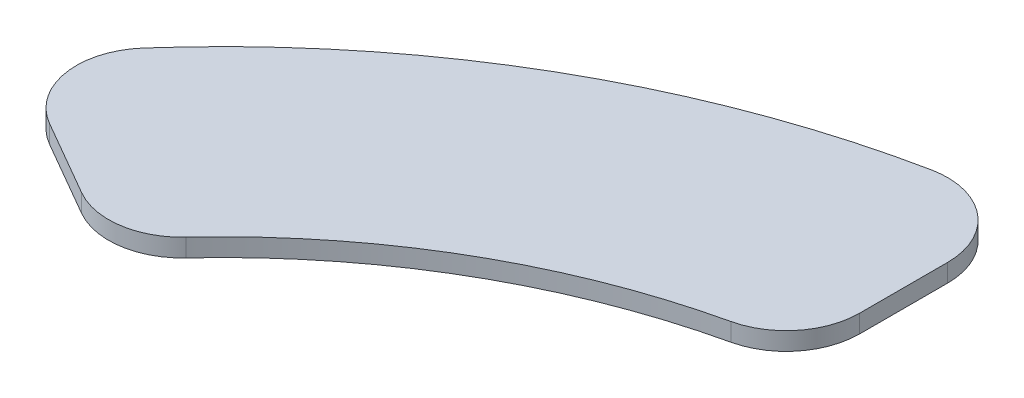
ISO-10303-21;
HEADER;
FILE_DESCRIPTION(('STEP AP214'),'2;1');
FILE_NAME('part.step','',(''),(''),'','','');
FILE_SCHEMA(('AUTOMOTIVE_DESIGN { 1 0 10303 214 1 1 1 1 }'));
ENDSEC;
DATA;
#1=APPLICATION_CONTEXT('core data for automotive mechanical design processes');
#2=APPLICATION_PROTOCOL_DEFINITION('international standard','automotive_design',2000,#1);
#3=PRODUCT_CONTEXT('',#1,'mechanical');
#4=PRODUCT('Part','Part','',(#3));
#5=PRODUCT_RELATED_PRODUCT_CATEGORY('part','',(#4));
#6=PRODUCT_DEFINITION_FORMATION('','',#4);
#7=PRODUCT_DEFINITION_CONTEXT('part definition',#1,'design');
#8=PRODUCT_DEFINITION('design','',#6,#7);
#9=PRODUCT_DEFINITION_SHAPE('','',#8);
#10=(LENGTH_UNIT() NAMED_UNIT(*) SI_UNIT(.MILLI.,.METRE.));
#11=(NAMED_UNIT(*) PLANE_ANGLE_UNIT() SI_UNIT($,.RADIAN.));
#12=(NAMED_UNIT(*) SI_UNIT($,.STERADIAN.) SOLID_ANGLE_UNIT());
#13=UNCERTAINTY_MEASURE_WITH_UNIT(LENGTH_MEASURE(1.E-05),#10,'distance_accuracy_value','');
#14=(GEOMETRIC_REPRESENTATION_CONTEXT(3) GLOBAL_UNCERTAINTY_ASSIGNED_CONTEXT((#13)) GLOBAL_UNIT_ASSIGNED_CONTEXT((#10,
#11,#12)) REPRESENTATION_CONTEXT('',''));
#15=CARTESIAN_POINT('',(0.,0.,0.));
#16=DIRECTION('',(0.,0.,1.));
#17=DIRECTION('',(1.,0.,0.));
#18=AXIS2_PLACEMENT_3D('',#15,#16,#17);
#19=CARTESIAN_POINT('',(62.5,124.639714135106,13.2525304162195));
#20=DIRECTION('',(0.,1.,0.));
#21=DIRECTION('',(0.,0.,1.));
#22=AXIS2_PLACEMENT_3D('',#19,#20,#21);
#23=CYLINDRICAL_SURFACE('',#22,5.55803388853137);
#24=CARTESIAN_POINT('',(62.5,125.999,13.2525304162195));
#25=DIRECTION('',(0.,1.,0.));
#26=DIRECTION('',(1.,0.,0.));
#27=AXIS2_PLACEMENT_3D('',#24,#25,#26);
#28=CIRCLE('',#27,5.55803388853137);
#29=CARTESIAN_POINT('',(68.0580338885314,125.999,13.2525304162195));
#30=VERTEX_POINT('',#29);
#31=CARTESIAN_POINT('',(61.3972154983073,125.999,7.80499821816059));
#32=VERTEX_POINT('',#31);
#33=EDGE_CURVE('E112',#30,#32,#28,.T.);
#34=ORIENTED_EDGE('',*,*,#33,.F.);
#35=DIRECTION('',(0.,1.,0.));
#36=VECTOR('',#35,1.);
#37=CARTESIAN_POINT('',(68.0580338885314,124.639714135106,13.2525304162195));
#38=LINE('',#37,#36);
#39=CARTESIAN_POINT('',(68.0580338885314,124.639714135106,13.2525304162195));
#40=VERTEX_POINT('',#39);
#41=EDGE_CURVE('E32',#40,#30,#38,.T.);
#42=ORIENTED_EDGE('',*,*,#41,.F.);
#43=CARTESIAN_POINT('',(62.5,124.639714135106,13.2525304162195));
#44=DIRECTION('',(0.,1.,0.));
#45=DIRECTION('',(1.,0.,0.));
#46=AXIS2_PLACEMENT_3D('',#43,#44,#45);
#47=CIRCLE('',#46,5.55803388853137);
#48=CARTESIAN_POINT('',(61.3972154983073,124.639714135106,7.80499821816059));
#49=VERTEX_POINT('',#48);
#50=EDGE_CURVE('E132',#40,#49,#47,.T.);
#51=ORIENTED_EDGE('',*,*,#50,.T.);
#52=DIRECTION('',(0.,1.,0.));
#53=VECTOR('',#52,1.);
#54=CARTESIAN_POINT('',(61.3972154983073,124.639714135106,7.80499821816059));
#55=LINE('',#54,#53);
#56=EDGE_CURVE('E10',#49,#32,#55,.T.);
#57=ORIENTED_EDGE('',*,*,#56,.T.);
#58=EDGE_LOOP('',(#34,#42,#51,#57));
#59=FACE_BOUND('',#58,.T.);
#60=ADVANCED_FACE('F16',(#59),#23,.T.);
#61=CARTESIAN_POINT('',(75.,124.639714135106,75.0000000000009));
#62=DIRECTION('',(0.,1.,0.));
#63=DIRECTION('',(0.,0.,1.));
#64=AXIS2_PLACEMENT_3D('',#61,#62,#63);
#65=CYLINDRICAL_SURFACE('',#64,68.5580338885313);
#66=CARTESIAN_POINT('',(75.,125.998999999999,75.0000000000009));
#67=DIRECTION('',(0.,1.,0.));
#68=DIRECTION('',(-0.198412698412699,0.,-0.980118564821926));
#69=AXIS2_PLACEMENT_3D('',#66,#67,#68);
#70=CIRCLE('',#69,68.5580338885313);
#71=CARTESIAN_POINT('',(23.6088137004321,125.999,29.6221421684095));
#72=VERTEX_POINT('',#71);
#73=EDGE_CURVE('E115',#32,#72,#70,.T.);
#74=ORIENTED_EDGE('',*,*,#73,.F.);
#75=ORIENTED_EDGE('',*,*,#56,.F.);
#76=CARTESIAN_POINT('',(75.,124.639714135106,75.0000000000009));
#77=DIRECTION('',(0.,1.,0.));
#78=DIRECTION('',(-0.198412698412699,0.,-0.980118564821926));
#79=AXIS2_PLACEMENT_3D('',#76,#77,#78);
#80=CIRCLE('',#79,68.5580338885313);
#81=CARTESIAN_POINT('',(23.6088137004321,124.639714135106,29.6221421684095));
#82=VERTEX_POINT('',#81);
#83=EDGE_CURVE('E141',#49,#82,#80,.T.);
#84=ORIENTED_EDGE('',*,*,#83,.T.);
#85=DIRECTION('',(0.,1.,0.));
#86=VECTOR('',#85,1.);
#87=CARTESIAN_POINT('',(23.6088137004321,124.639714135106,29.6221421684095));
#88=LINE('',#87,#86);
#89=EDGE_CURVE('E24',#82,#72,#88,.T.);
#90=ORIENTED_EDGE('',*,*,#89,.T.);
#91=EDGE_LOOP('',(#74,#75,#84,#90));
#92=FACE_BOUND('',#91,.T.);
#93=ADVANCED_FACE('F140',(#92),#65,.T.);
#94=CARTESIAN_POINT('',(27.7751227210385,124.639714135106,33.3009476608047));
#95=DIRECTION('',(0.,1.,0.));
#96=DIRECTION('',(0.,0.,1.));
#97=AXIS2_PLACEMENT_3D('',#94,#95,#96);
#98=CYLINDRICAL_SURFACE('',#97,5.55803388853136);
#99=CARTESIAN_POINT('',(27.7751227210385,125.999,33.3009476608047));
#100=DIRECTION('',(0.,1.,0.));
#101=DIRECTION('',(-0.749601226650182,0.,-0.661889719669782));
#102=AXIS2_PLACEMENT_3D('',#99,#100,#101);
#103=CIRCLE('',#102,5.55803388853136);
#104=CARTESIAN_POINT('',(24.9961057767728,125.999,38.1143462033677));
#105=VERTEX_POINT('',#104);
#106=EDGE_CURVE('E118',#72,#105,#103,.T.);
#107=ORIENTED_EDGE('',*,*,#106,.F.);
#108=ORIENTED_EDGE('',*,*,#89,.F.);
#109=CARTESIAN_POINT('',(27.7751227210385,124.639714135106,33.3009476608047));
#110=DIRECTION('',(0.,1.,0.));
#111=DIRECTION('',(-0.749601226650182,0.,-0.661889719669782));
#112=AXIS2_PLACEMENT_3D('',#109,#110,#111);
#113=CIRCLE('',#112,5.55803388853136);
#114=CARTESIAN_POINT('',(24.9961057767728,124.639714135106,38.1143462033677));
#115=VERTEX_POINT('',#114);
#116=EDGE_CURVE('E150',#82,#115,#113,.T.);
#117=ORIENTED_EDGE('',*,*,#116,.T.);
#118=DIRECTION('',(0.,1.,0.));
#119=VECTOR('',#118,1.);
#120=CARTESIAN_POINT('',(24.9961057767728,124.639714135106,38.1143462033677));
#121=LINE('',#120,#119);
#122=EDGE_CURVE('E138',#115,#105,#121,.T.);
#123=ORIENTED_EDGE('',*,*,#122,.T.);
#124=EDGE_LOOP('',(#107,#108,#117,#123));
#125=FACE_BOUND('',#124,.T.);
#126=ADVANCED_FACE('F145',(#125),#98,.T.);
#127=CARTESIAN_POINT('',(24.9961057767728,124.639714135106,38.1143462033677));
#128=DIRECTION('',(-0.5,0.,0.866025403784439));
#129=DIRECTION('',(0.866025403784439,0.,0.5));
#130=AXIS2_PLACEMENT_3D('',#127,#128,#129);
#131=PLANE('',#130);
#132=DIRECTION('',(0.866025403784439,0.,0.5));
#133=VECTOR('',#132,1.);
#134=CARTESIAN_POINT('',(24.9961057767728,125.999,38.1143462033677));
#135=LINE('',#134,#133);
#136=CARTESIAN_POINT('',(30.7530618939737,125.999,41.4381263673465));
#137=VERTEX_POINT('',#136);
#138=EDGE_CURVE('E121',#105,#137,#135,.T.);
#139=ORIENTED_EDGE('',*,*,#138,.F.);
#140=ORIENTED_EDGE('',*,*,#122,.F.);
#141=DIRECTION('',(0.866025403784439,0.,0.5));
#142=VECTOR('',#141,1.);
#143=CARTESIAN_POINT('',(24.9961057767728,124.639714135106,38.1143462033677));
#144=LINE('',#143,#142);
#145=CARTESIAN_POINT('',(30.7530618939737,124.639714135106,41.4381263673465));
#146=VERTEX_POINT('',#145);
#147=EDGE_CURVE('E154',#115,#146,#144,.T.);
#148=ORIENTED_EDGE('',*,*,#147,.T.);
#149=DIRECTION('',(0.,1.,0.));
#150=VECTOR('',#149,1.);
#151=CARTESIAN_POINT('',(30.7530618939737,124.639714135106,41.4381263673465));
#152=LINE('',#151,#150);
#153=EDGE_CURVE('E136',#146,#137,#152,.T.);
#154=ORIENTED_EDGE('',*,*,#153,.T.);
#155=EDGE_LOOP('',(#139,#140,#148,#154));
#156=FACE_BOUND('',#155,.T.);
#157=ADVANCED_FACE('F161',(#156),#131,.T.);
#158=CARTESIAN_POINT('',(33.5320788382394,124.639714135106,36.6247278247835));
#159=DIRECTION('',(0.,1.,0.));
#160=DIRECTION('',(0.,0.,1.));
#161=AXIS2_PLACEMENT_3D('',#158,#159,#160);
#162=CYLINDRICAL_SURFACE('',#161,5.55803388853137);
#163=CARTESIAN_POINT('',(33.5320788382394,125.999,36.6247278247835));
#164=DIRECTION('',(0.,1.,0.));
#165=DIRECTION('',(-0.5,0.,0.866025403784439));
#166=AXIS2_PLACEMENT_3D('',#163,#164,#165);
#167=CIRCLE('',#166,5.55803388853137);
#168=CARTESIAN_POINT('',(37.6113728400804,125.999,40.3997908908273));
#169=VERTEX_POINT('',#168);
#170=EDGE_CURVE('E124',#137,#169,#167,.T.);
#171=ORIENTED_EDGE('',*,*,#170,.F.);
#172=ORIENTED_EDGE('',*,*,#153,.F.);
#173=CARTESIAN_POINT('',(33.5320788382394,124.639714135106,36.6247278247835));
#174=DIRECTION('',(0.,1.,0.));
#175=DIRECTION('',(-0.5,0.,0.866025403784439));
#176=AXIS2_PLACEMENT_3D('',#173,#174,#175);
#177=CIRCLE('',#176,5.55803388853137);
#178=CARTESIAN_POINT('',(37.6113728400804,124.639714135106,40.3997908908273));
#179=VERTEX_POINT('',#178);
#180=EDGE_CURVE('E103',#146,#179,#177,.T.);
#181=ORIENTED_EDGE('',*,*,#180,.T.);
#182=DIRECTION('',(0.,1.,0.));
#183=VECTOR('',#182,1.);
#184=CARTESIAN_POINT('',(37.6113728400804,124.639714135106,40.3997908908273));
#185=LINE('',#184,#183);
#186=EDGE_CURVE('E95',#179,#169,#185,.T.);
#187=ORIENTED_EDGE('',*,*,#186,.T.);
#188=EDGE_LOOP('',(#171,#172,#181,#187));
#189=FACE_BOUND('',#188,.T.);
#190=ADVANCED_FACE('F158',(#189),#162,.T.);
#191=CARTESIAN_POINT('',(75.,124.639714135106,75.0000000000009));
#192=DIRECTION('',(0.,1.,0.));
#193=DIRECTION('',(0.,0.,1.));
#194=AXIS2_PLACEMENT_3D('',#191,#192,#193);
#195=CYLINDRICAL_SURFACE('',#194,50.9419661114686);
#196=CARTESIAN_POINT('',(75.,125.998999999999,75.0000000000009));
#197=DIRECTION('',(0.,-1.,0.));
#198=DIRECTION('',(-0.733945507287798,0.,-0.679208357083493));
#199=AXIS2_PLACEMENT_3D('',#196,#197,#198);
#200=CIRCLE('',#199,50.9419661114686);
#201=CARTESIAN_POINT('',(63.7296535151618,125.999,25.3203945122988));
#202=VERTEX_POINT('',#201);
#203=EDGE_CURVE('E127',#169,#202,#200,.T.);
#204=ORIENTED_EDGE('',*,*,#203,.F.);
#205=ORIENTED_EDGE('',*,*,#186,.F.);
#206=CARTESIAN_POINT('',(75.,124.639714135106,75.0000000000009));
#207=DIRECTION('',(0.,-1.,0.));
#208=DIRECTION('',(-0.733945507287798,0.,-0.679208357083493));
#209=AXIS2_PLACEMENT_3D('',#206,#207,#208);
#210=CIRCLE('',#209,50.9419661114686);
#211=CARTESIAN_POINT('',(63.7296535151618,124.639714135106,25.3203945122988));
#212=VERTEX_POINT('',#211);
#213=EDGE_CURVE('E98',#179,#212,#210,.T.);
#214=ORIENTED_EDGE('',*,*,#213,.T.);
#215=DIRECTION('',(0.,1.,0.));
#216=VECTOR('',#215,1.);
#217=CARTESIAN_POINT('',(63.7296535151618,124.639714135106,25.3203945122988));
#218=LINE('',#217,#216);
#219=EDGE_CURVE('E84',#212,#202,#218,.T.);
#220=ORIENTED_EDGE('',*,*,#219,.T.);
#221=EDGE_LOOP('',(#204,#205,#214,#220));
#222=FACE_BOUND('',#221,.T.);
#223=ADVANCED_FACE('F99',(#222),#195,.F.);
#224=CARTESIAN_POINT('',(62.5,124.639714135106,19.9000907441772));
#225=DIRECTION('',(0.,1.,0.));
#226=DIRECTION('',(0.,0.,1.));
#227=AXIS2_PLACEMENT_3D('',#224,#225,#226);
#228=CYLINDRICAL_SURFACE('',#227,5.55803388853137);
#229=CARTESIAN_POINT('',(62.5,125.999,19.9000907441772));
#230=DIRECTION('',(0.,1.,0.));
#231=DIRECTION('',(0.221238938053101,0.,0.975219632846435));
#232=AXIS2_PLACEMENT_3D('',#229,#230,#231);
#233=CIRCLE('',#232,5.55803388853137);
#234=CARTESIAN_POINT('',(68.0580338885314,125.999,19.9000907441772));
#235=VERTEX_POINT('',#234);
#236=EDGE_CURVE('E91',#202,#235,#233,.T.);
#237=ORIENTED_EDGE('',*,*,#236,.F.);
#238=ORIENTED_EDGE('',*,*,#219,.F.);
#239=CARTESIAN_POINT('',(62.5,124.639714135106,19.9000907441772));
#240=DIRECTION('',(0.,1.,0.));
#241=DIRECTION('',(0.221238938053101,0.,0.975219632846435));
#242=AXIS2_PLACEMENT_3D('',#239,#240,#241);
#243=CIRCLE('',#242,5.55803388853137);
#244=CARTESIAN_POINT('',(68.0580338885314,124.639714135106,19.9000907441772));
#245=VERTEX_POINT('',#244);
#246=EDGE_CURVE('E88',#212,#245,#243,.T.);
#247=ORIENTED_EDGE('',*,*,#246,.T.);
#248=DIRECTION('',(0.,1.,0.));
#249=VECTOR('',#248,1.);
#250=CARTESIAN_POINT('',(68.0580338885314,124.639714135106,19.9000907441772));
#251=LINE('',#250,#249);
#252=EDGE_CURVE('E60',#245,#235,#251,.T.);
#253=ORIENTED_EDGE('',*,*,#252,.T.);
#254=EDGE_LOOP('',(#237,#238,#247,#253));
#255=FACE_BOUND('',#254,.T.);
#256=ADVANCED_FACE('F86',(#255),#228,.T.);
#257=CARTESIAN_POINT('',(68.0580338885314,124.639714135106,19.9000907441772));
#258=DIRECTION('',(1.,0.,0.));
#259=DIRECTION('',(0.,0.,-1.));
#260=AXIS2_PLACEMENT_3D('',#257,#258,#259);
#261=PLANE('',#260);
#262=DIRECTION('',(0.,0.,-1.));
#263=VECTOR('',#262,1.);
#264=CARTESIAN_POINT('',(68.0580338885314,125.999,19.9000907441772));
#265=LINE('',#264,#263);
#266=EDGE_CURVE('E130',#235,#30,#265,.T.);
#267=ORIENTED_EDGE('',*,*,#266,.F.);
#268=ORIENTED_EDGE('',*,*,#252,.F.);
#269=DIRECTION('',(0.,0.,-1.));
#270=VECTOR('',#269,1.);
#271=CARTESIAN_POINT('',(68.0580338885314,124.639714135106,19.9000907441772));
#272=LINE('',#271,#270);
#273=EDGE_CURVE('E107',#245,#40,#272,.T.);
#274=ORIENTED_EDGE('',*,*,#273,.T.);
#275=ORIENTED_EDGE('',*,*,#41,.T.);
#276=EDGE_LOOP('',(#267,#268,#274,#275));
#277=FACE_BOUND('',#276,.T.);
#278=ADVANCED_FACE('F217',(#277),#261,.T.);
#279=CARTESIAN_POINT('',(110.457721302983,124.639714135106,90.0000000000008));
#280=DIRECTION('',(0.,1.,0.));
#281=DIRECTION('',(-1.,0.,0.));
#282=AXIS2_PLACEMENT_3D('',#279,#280,#281);
#283=PLANE('',#282);
#284=ORIENTED_EDGE('',*,*,#50,.F.);
#285=ORIENTED_EDGE('',*,*,#273,.F.);
#286=ORIENTED_EDGE('',*,*,#246,.F.);
#287=ORIENTED_EDGE('',*,*,#213,.F.);
#288=ORIENTED_EDGE('',*,*,#180,.F.);
#289=ORIENTED_EDGE('',*,*,#147,.F.);
#290=ORIENTED_EDGE('',*,*,#116,.F.);
#291=ORIENTED_EDGE('',*,*,#83,.F.);
#292=EDGE_LOOP('',(#284,#285,#286,#287,#288,#289,#290,#291));
#293=FACE_BOUND('',#292,.T.);
#294=ADVANCED_FACE('F106',(#293),#283,.F.);
#295=CARTESIAN_POINT('',(110.457721302983,125.998999999999,90.0000000000009));
#296=DIRECTION('',(0.,1.,0.));
#297=DIRECTION('',(-1.,0.,0.));
#298=AXIS2_PLACEMENT_3D('',#295,#296,#297);
#299=PLANE('',#298);
#300=ORIENTED_EDGE('',*,*,#33,.T.);
#301=ORIENTED_EDGE('',*,*,#73,.T.);
#302=ORIENTED_EDGE('',*,*,#106,.T.);
#303=ORIENTED_EDGE('',*,*,#138,.T.);
#304=ORIENTED_EDGE('',*,*,#170,.T.);
#305=ORIENTED_EDGE('',*,*,#203,.T.);
#306=ORIENTED_EDGE('',*,*,#236,.T.);
#307=ORIENTED_EDGE('',*,*,#266,.T.);
#308=EDGE_LOOP('',(#300,#301,#302,#303,#304,#305,#306,#307));
#309=FACE_BOUND('',#308,.T.);
#310=ADVANCED_FACE('F148',(#309),#299,.T.);
#311=CLOSED_SHELL('',(#60,#93,#126,#157,#190,#223,#256,#278,#294,#310));
#312=MANIFOLD_SOLID_BREP('B1',#311);
#313=ADVANCED_BREP_SHAPE_REPRESENTATION('',(#18,#312),#14);
#314=SHAPE_DEFINITION_REPRESENTATION(#9,#313);
ENDSEC;
END-ISO-10303-21;
